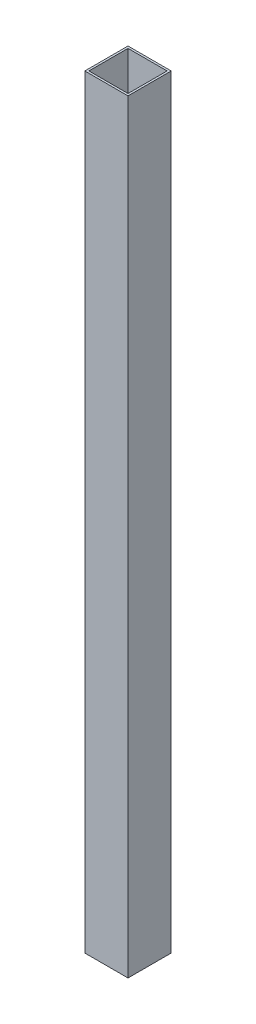
ISO-10303-21;
HEADER;
FILE_DESCRIPTION(('STEP AP214'),'2;1');
FILE_NAME('part.step','',(''),(''),'','','');
FILE_SCHEMA(('AUTOMOTIVE_DESIGN { 1 0 10303 214 1 1 1 1 }'));
ENDSEC;
DATA;
#1=APPLICATION_CONTEXT('core data for automotive mechanical design processes');
#2=APPLICATION_PROTOCOL_DEFINITION('international standard','automotive_design',2000,#1);
#3=PRODUCT_CONTEXT('',#1,'mechanical');
#4=PRODUCT('Part','Part','',(#3));
#5=PRODUCT_RELATED_PRODUCT_CATEGORY('part','',(#4));
#6=PRODUCT_DEFINITION_FORMATION('','',#4);
#7=PRODUCT_DEFINITION_CONTEXT('part definition',#1,'design');
#8=PRODUCT_DEFINITION('design','',#6,#7);
#9=PRODUCT_DEFINITION_SHAPE('','',#8);
#10=(LENGTH_UNIT() NAMED_UNIT(*) SI_UNIT(.MILLI.,.METRE.));
#11=(NAMED_UNIT(*) PLANE_ANGLE_UNIT() SI_UNIT($,.RADIAN.));
#12=(NAMED_UNIT(*) SI_UNIT($,.STERADIAN.) SOLID_ANGLE_UNIT());
#13=UNCERTAINTY_MEASURE_WITH_UNIT(LENGTH_MEASURE(1.E-05),#10,'distance_accuracy_value','');
#14=(GEOMETRIC_REPRESENTATION_CONTEXT(3) GLOBAL_UNCERTAINTY_ASSIGNED_CONTEXT((#13)) GLOBAL_UNIT_ASSIGNED_CONTEXT((#10,
#11,#12)) REPRESENTATION_CONTEXT('',''));
#15=CARTESIAN_POINT('',(0.,0.,0.));
#16=DIRECTION('',(0.,0.,1.));
#17=DIRECTION('',(1.,0.,0.));
#18=AXIS2_PLACEMENT_3D('',#15,#16,#17);
#19=CARTESIAN_POINT('',(0.,449.2,0.));
#20=DIRECTION('',(0.,-1.,0.));
#21=DIRECTION('',(0.,0.,-1.));
#22=AXIS2_PLACEMENT_3D('',#19,#20,#21);
#23=PLANE('',#22);
#24=DIRECTION('',(0.,0.,-1.));
#25=VECTOR('',#24,1.);
#26=CARTESIAN_POINT('',(12.7,449.2,12.7));
#27=LINE('',#26,#25);
#28=CARTESIAN_POINT('',(12.7,449.2,12.7));
#29=VERTEX_POINT('',#28);
#30=CARTESIAN_POINT('',(12.7,449.2,-12.7));
#31=VERTEX_POINT('',#30);
#32=EDGE_CURVE('E138',#29,#31,#27,.T.);
#33=ORIENTED_EDGE('',*,*,#32,.T.);
#34=DIRECTION('',(-1.,0.,0.));
#35=VECTOR('',#34,1.);
#36=CARTESIAN_POINT('',(-12.7,449.2,-12.7));
#37=LINE('',#36,#35);
#38=CARTESIAN_POINT('',(-12.7,449.2,-12.7));
#39=VERTEX_POINT('',#38);
#40=EDGE_CURVE('E141',#31,#39,#37,.T.);
#41=ORIENTED_EDGE('',*,*,#40,.T.);
#42=DIRECTION('',(0.,0.,1.));
#43=VECTOR('',#42,1.);
#44=CARTESIAN_POINT('',(-12.7,449.2,12.7));
#45=LINE('',#44,#43);
#46=CARTESIAN_POINT('',(-12.7,449.2,12.7));
#47=VERTEX_POINT('',#46);
#48=EDGE_CURVE('E144',#39,#47,#45,.T.);
#49=ORIENTED_EDGE('',*,*,#48,.T.);
#50=DIRECTION('',(1.,0.,0.));
#51=VECTOR('',#50,1.);
#52=CARTESIAN_POINT('',(-12.7,449.2,12.7));
#53=LINE('',#52,#51);
#54=EDGE_CURVE('E146',#47,#29,#53,.T.);
#55=ORIENTED_EDGE('',*,*,#54,.T.);
#56=EDGE_LOOP('',(#33,#41,#49,#55));
#57=FACE_BOUND('',#56,.T.);
#58=DIRECTION('',(0.,0.,1.));
#59=VECTOR('',#58,1.);
#60=CARTESIAN_POINT('',(-11.5,449.2,11.5));
#61=LINE('',#60,#59);
#62=CARTESIAN_POINT('',(-11.5,449.2,-11.5));
#63=VERTEX_POINT('',#62);
#64=CARTESIAN_POINT('',(-11.5,449.2,11.5));
#65=VERTEX_POINT('',#64);
#66=EDGE_CURVE('E102',#63,#65,#61,.T.);
#67=ORIENTED_EDGE('',*,*,#66,.F.);
#68=DIRECTION('',(-1.,0.,0.));
#69=VECTOR('',#68,1.);
#70=CARTESIAN_POINT('',(-11.5,449.2,-11.5));
#71=LINE('',#70,#69);
#72=CARTESIAN_POINT('',(11.5,449.2,-11.5));
#73=VERTEX_POINT('',#72);
#74=EDGE_CURVE('E124',#73,#63,#71,.T.);
#75=ORIENTED_EDGE('',*,*,#74,.F.);
#76=DIRECTION('',(0.,0.,-1.));
#77=VECTOR('',#76,1.);
#78=CARTESIAN_POINT('',(11.5,449.2,11.5));
#79=LINE('',#78,#77);
#80=CARTESIAN_POINT('',(11.5,449.2,11.5));
#81=VERTEX_POINT('',#80);
#82=EDGE_CURVE('E122',#81,#73,#79,.T.);
#83=ORIENTED_EDGE('',*,*,#82,.F.);
#84=DIRECTION('',(1.,0.,0.));
#85=VECTOR('',#84,1.);
#86=CARTESIAN_POINT('',(-11.5,449.2,11.5));
#87=LINE('',#86,#85);
#88=EDGE_CURVE('E110',#65,#81,#87,.T.);
#89=ORIENTED_EDGE('',*,*,#88,.F.);
#90=EDGE_LOOP('',(#67,#75,#83,#89));
#91=FACE_BOUND('',#90,.T.);
#92=ADVANCED_FACE('F37',(#57,#91),#23,.F.);
#93=CARTESIAN_POINT('',(0.,0.,0.));
#94=DIRECTION('',(0.,-1.,0.));
#95=DIRECTION('',(0.,0.,-1.));
#96=AXIS2_PLACEMENT_3D('',#93,#94,#95);
#97=PLANE('',#96);
#98=DIRECTION('',(0.,0.,-1.));
#99=VECTOR('',#98,1.);
#100=CARTESIAN_POINT('',(12.7,0.,12.7));
#101=LINE('',#100,#99);
#102=CARTESIAN_POINT('',(12.7,0.,12.7));
#103=VERTEX_POINT('',#102);
#104=CARTESIAN_POINT('',(12.7,0.,-12.7));
#105=VERTEX_POINT('',#104);
#106=EDGE_CURVE('E118',#103,#105,#101,.T.);
#107=ORIENTED_EDGE('',*,*,#106,.F.);
#108=DIRECTION('',(1.,0.,0.));
#109=VECTOR('',#108,1.);
#110=CARTESIAN_POINT('',(-12.7,0.,12.7));
#111=LINE('',#110,#109);
#112=CARTESIAN_POINT('',(-12.7,0.,12.7));
#113=VERTEX_POINT('',#112);
#114=EDGE_CURVE('E142',#113,#103,#111,.T.);
#115=ORIENTED_EDGE('',*,*,#114,.F.);
#116=DIRECTION('',(0.,0.,1.));
#117=VECTOR('',#116,1.);
#118=CARTESIAN_POINT('',(-12.7,0.,12.7));
#119=LINE('',#118,#117);
#120=CARTESIAN_POINT('',(-12.7,0.,-12.7));
#121=VERTEX_POINT('',#120);
#122=EDGE_CURVE('E153',#121,#113,#119,.T.);
#123=ORIENTED_EDGE('',*,*,#122,.F.);
#124=DIRECTION('',(-1.,0.,0.));
#125=VECTOR('',#124,1.);
#126=CARTESIAN_POINT('',(-12.7,0.,-12.7));
#127=LINE('',#126,#125);
#128=EDGE_CURVE('E151',#105,#121,#127,.T.);
#129=ORIENTED_EDGE('',*,*,#128,.F.);
#130=EDGE_LOOP('',(#107,#115,#123,#129));
#131=FACE_BOUND('',#130,.T.);
#132=DIRECTION('',(-1.,0.,0.));
#133=VECTOR('',#132,1.);
#134=CARTESIAN_POINT('',(-11.5,0.,-11.5));
#135=LINE('',#134,#133);
#136=CARTESIAN_POINT('',(11.5,0.,-11.5));
#137=VERTEX_POINT('',#136);
#138=CARTESIAN_POINT('',(-11.5,0.,-11.5));
#139=VERTEX_POINT('',#138);
#140=EDGE_CURVE('E111',#137,#139,#135,.T.);
#141=ORIENTED_EDGE('',*,*,#140,.T.);
#142=DIRECTION('',(0.,0.,1.));
#143=VECTOR('',#142,1.);
#144=CARTESIAN_POINT('',(-11.5,0.,11.5));
#145=LINE('',#144,#143);
#146=CARTESIAN_POINT('',(-11.5,0.,11.5));
#147=VERTEX_POINT('',#146);
#148=EDGE_CURVE('E60',#139,#147,#145,.T.);
#149=ORIENTED_EDGE('',*,*,#148,.T.);
#150=DIRECTION('',(1.,0.,0.));
#151=VECTOR('',#150,1.);
#152=CARTESIAN_POINT('',(-11.5,0.,11.5));
#153=LINE('',#152,#151);
#154=CARTESIAN_POINT('',(11.5,0.,11.5));
#155=VERTEX_POINT('',#154);
#156=EDGE_CURVE('E117',#147,#155,#153,.T.);
#157=ORIENTED_EDGE('',*,*,#156,.T.);
#158=DIRECTION('',(0.,0.,-1.));
#159=VECTOR('',#158,1.);
#160=CARTESIAN_POINT('',(11.5,0.,11.5));
#161=LINE('',#160,#159);
#162=EDGE_CURVE('E130',#155,#137,#161,.T.);
#163=ORIENTED_EDGE('',*,*,#162,.T.);
#164=EDGE_LOOP('',(#141,#149,#157,#163));
#165=FACE_BOUND('',#164,.T.);
#166=ADVANCED_FACE('F171',(#131,#165),#97,.T.);
#167=CARTESIAN_POINT('',(12.7,449.2,12.7));
#168=DIRECTION('',(-1.,0.,0.));
#169=DIRECTION('',(0.,0.,1.));
#170=AXIS2_PLACEMENT_3D('',#167,#168,#169);
#171=PLANE('',#170);
#172=ORIENTED_EDGE('',*,*,#106,.T.);
#173=DIRECTION('',(0.,-1.,0.));
#174=VECTOR('',#173,1.);
#175=CARTESIAN_POINT('',(12.7,449.2,-12.7));
#176=LINE('',#175,#174);
#177=EDGE_CURVE('E11',#31,#105,#176,.T.);
#178=ORIENTED_EDGE('',*,*,#177,.F.);
#179=ORIENTED_EDGE('',*,*,#32,.F.);
#180=DIRECTION('',(0.,-1.,0.));
#181=VECTOR('',#180,1.);
#182=CARTESIAN_POINT('',(12.7,449.2,12.7));
#183=LINE('',#182,#181);
#184=EDGE_CURVE('E148',#29,#103,#183,.T.);
#185=ORIENTED_EDGE('',*,*,#184,.T.);
#186=EDGE_LOOP('',(#172,#178,#179,#185));
#187=FACE_BOUND('',#186,.T.);
#188=ADVANCED_FACE('F39',(#187),#171,.F.);
#189=CARTESIAN_POINT('',(-12.7,449.2,-12.7));
#190=DIRECTION('',(0.,0.,1.));
#191=DIRECTION('',(1.,0.,0.));
#192=AXIS2_PLACEMENT_3D('',#189,#190,#191);
#193=PLANE('',#192);
#194=ORIENTED_EDGE('',*,*,#128,.T.);
#195=DIRECTION('',(0.,-1.,0.));
#196=VECTOR('',#195,1.);
#197=CARTESIAN_POINT('',(-12.7,449.2,-12.7));
#198=LINE('',#197,#196);
#199=EDGE_CURVE('E45',#39,#121,#198,.T.);
#200=ORIENTED_EDGE('',*,*,#199,.F.);
#201=ORIENTED_EDGE('',*,*,#40,.F.);
#202=ORIENTED_EDGE('',*,*,#177,.T.);
#203=EDGE_LOOP('',(#194,#200,#201,#202));
#204=FACE_BOUND('',#203,.T.);
#205=ADVANCED_FACE('F181',(#204),#193,.F.);
#206=CARTESIAN_POINT('',(-12.7,449.2,12.7));
#207=DIRECTION('',(1.,0.,0.));
#208=DIRECTION('',(0.,0.,-1.));
#209=AXIS2_PLACEMENT_3D('',#206,#207,#208);
#210=PLANE('',#209);
#211=ORIENTED_EDGE('',*,*,#122,.T.);
#212=DIRECTION('',(0.,-1.,0.));
#213=VECTOR('',#212,1.);
#214=CARTESIAN_POINT('',(-12.7,449.2,12.7));
#215=LINE('',#214,#213);
#216=EDGE_CURVE('E158',#47,#113,#215,.T.);
#217=ORIENTED_EDGE('',*,*,#216,.F.);
#218=ORIENTED_EDGE('',*,*,#48,.F.);
#219=ORIENTED_EDGE('',*,*,#199,.T.);
#220=EDGE_LOOP('',(#211,#217,#218,#219));
#221=FACE_BOUND('',#220,.T.);
#222=ADVANCED_FACE('F165',(#221),#210,.F.);
#223=CARTESIAN_POINT('',(-12.7,449.2,12.7));
#224=DIRECTION('',(0.,0.,-1.));
#225=DIRECTION('',(-1.,0.,0.));
#226=AXIS2_PLACEMENT_3D('',#223,#224,#225);
#227=PLANE('',#226);
#228=ORIENTED_EDGE('',*,*,#114,.T.);
#229=ORIENTED_EDGE('',*,*,#184,.F.);
#230=ORIENTED_EDGE('',*,*,#54,.F.);
#231=ORIENTED_EDGE('',*,*,#216,.T.);
#232=EDGE_LOOP('',(#228,#229,#230,#231));
#233=FACE_BOUND('',#232,.T.);
#234=ADVANCED_FACE('F175',(#233),#227,.F.);
#235=CARTESIAN_POINT('',(-11.5,449.2,11.5));
#236=DIRECTION('',(1.,0.,0.));
#237=DIRECTION('',(0.,0.,-1.));
#238=AXIS2_PLACEMENT_3D('',#235,#236,#237);
#239=PLANE('',#238);
#240=ORIENTED_EDGE('',*,*,#148,.F.);
#241=DIRECTION('',(0.,-1.,0.));
#242=VECTOR('',#241,1.);
#243=CARTESIAN_POINT('',(-11.5,449.2,-11.5));
#244=LINE('',#243,#242);
#245=EDGE_CURVE('E106',#63,#139,#244,.T.);
#246=ORIENTED_EDGE('',*,*,#245,.F.);
#247=ORIENTED_EDGE('',*,*,#66,.T.);
#248=DIRECTION('',(0.,-1.,0.));
#249=VECTOR('',#248,1.);
#250=CARTESIAN_POINT('',(-11.5,449.2,11.5));
#251=LINE('',#250,#249);
#252=EDGE_CURVE('E105',#65,#147,#251,.T.);
#253=ORIENTED_EDGE('',*,*,#252,.T.);
#254=EDGE_LOOP('',(#240,#246,#247,#253));
#255=FACE_BOUND('',#254,.T.);
#256=ADVANCED_FACE('F104',(#255),#239,.T.);
#257=CARTESIAN_POINT('',(-11.5,449.2,11.5));
#258=DIRECTION('',(0.,0.,-1.));
#259=DIRECTION('',(-1.,0.,0.));
#260=AXIS2_PLACEMENT_3D('',#257,#258,#259);
#261=PLANE('',#260);
#262=ORIENTED_EDGE('',*,*,#156,.F.);
#263=ORIENTED_EDGE('',*,*,#252,.F.);
#264=ORIENTED_EDGE('',*,*,#88,.T.);
#265=DIRECTION('',(0.,-1.,0.));
#266=VECTOR('',#265,1.);
#267=CARTESIAN_POINT('',(11.5,449.2,11.5));
#268=LINE('',#267,#266);
#269=EDGE_CURVE('E119',#81,#155,#268,.T.);
#270=ORIENTED_EDGE('',*,*,#269,.T.);
#271=EDGE_LOOP('',(#262,#263,#264,#270));
#272=FACE_BOUND('',#271,.T.);
#273=ADVANCED_FACE('F114',(#272),#261,.T.);
#274=CARTESIAN_POINT('',(11.5,449.2,11.5));
#275=DIRECTION('',(-1.,0.,0.));
#276=DIRECTION('',(0.,0.,1.));
#277=AXIS2_PLACEMENT_3D('',#274,#275,#276);
#278=PLANE('',#277);
#279=ORIENTED_EDGE('',*,*,#162,.F.);
#280=ORIENTED_EDGE('',*,*,#269,.F.);
#281=ORIENTED_EDGE('',*,*,#82,.T.);
#282=DIRECTION('',(0.,-1.,0.));
#283=VECTOR('',#282,1.);
#284=CARTESIAN_POINT('',(11.5,449.2,-11.5));
#285=LINE('',#284,#283);
#286=EDGE_CURVE('E52',#73,#137,#285,.T.);
#287=ORIENTED_EDGE('',*,*,#286,.T.);
#288=EDGE_LOOP('',(#279,#280,#281,#287));
#289=FACE_BOUND('',#288,.T.);
#290=ADVANCED_FACE('F204',(#289),#278,.T.);
#291=CARTESIAN_POINT('',(-11.5,449.2,-11.5));
#292=DIRECTION('',(0.,0.,1.));
#293=DIRECTION('',(1.,0.,0.));
#294=AXIS2_PLACEMENT_3D('',#291,#292,#293);
#295=PLANE('',#294);
#296=ORIENTED_EDGE('',*,*,#140,.F.);
#297=ORIENTED_EDGE('',*,*,#286,.F.);
#298=ORIENTED_EDGE('',*,*,#74,.T.);
#299=ORIENTED_EDGE('',*,*,#245,.T.);
#300=EDGE_LOOP('',(#296,#297,#298,#299));
#301=FACE_BOUND('',#300,.T.);
#302=ADVANCED_FACE('F208',(#301),#295,.T.);
#303=CLOSED_SHELL('',(#92,#166,#188,#205,#222,#234,#256,#273,#290,#302));
#304=MANIFOLD_SOLID_BREP('B2',#303);
#305=ADVANCED_BREP_SHAPE_REPRESENTATION('',(#18,#304),#14);
#306=SHAPE_DEFINITION_REPRESENTATION(#9,#305);
ENDSEC;
END-ISO-10303-21;
